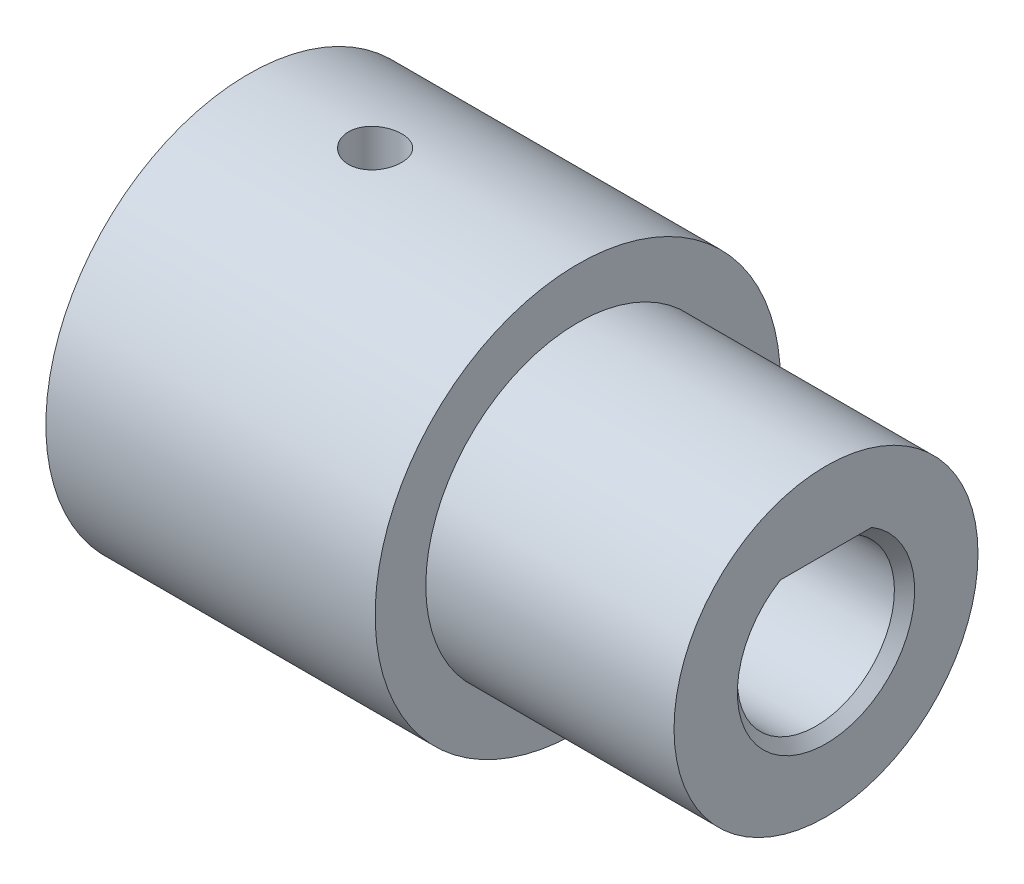
ISO-10303-21;
HEADER;
FILE_DESCRIPTION(('STEP AP214'),'2;1');
FILE_NAME('part.step','',(''),(''),'','','');
FILE_SCHEMA(('AUTOMOTIVE_DESIGN { 1 0 10303 214 1 1 1 1 }'));
ENDSEC;
DATA;
#1=APPLICATION_CONTEXT('core data for automotive mechanical design processes');
#2=APPLICATION_PROTOCOL_DEFINITION('international standard','automotive_design',2000,#1);
#3=PRODUCT_CONTEXT('',#1,'mechanical');
#4=PRODUCT('Part','Part','',(#3));
#5=PRODUCT_RELATED_PRODUCT_CATEGORY('part','',(#4));
#6=PRODUCT_DEFINITION_FORMATION('','',#4);
#7=PRODUCT_DEFINITION_CONTEXT('part definition',#1,'design');
#8=PRODUCT_DEFINITION('design','',#6,#7);
#9=PRODUCT_DEFINITION_SHAPE('','',#8);
#10=(LENGTH_UNIT() NAMED_UNIT(*) SI_UNIT(.MILLI.,.METRE.));
#11=(NAMED_UNIT(*) PLANE_ANGLE_UNIT() SI_UNIT($,.RADIAN.));
#12=(NAMED_UNIT(*) SI_UNIT($,.STERADIAN.) SOLID_ANGLE_UNIT());
#13=UNCERTAINTY_MEASURE_WITH_UNIT(LENGTH_MEASURE(1.E-05),#10,'distance_accuracy_value','');
#14=(GEOMETRIC_REPRESENTATION_CONTEXT(3) GLOBAL_UNCERTAINTY_ASSIGNED_CONTEXT((#13)) GLOBAL_UNIT_ASSIGNED_CONTEXT((#10,
#11,#12)) REPRESENTATION_CONTEXT('',''));
#15=CARTESIAN_POINT('',(0.,0.,0.));
#16=DIRECTION('',(0.,0.,1.));
#17=DIRECTION('',(1.,0.,0.));
#18=AXIS2_PLACEMENT_3D('',#15,#16,#17);
#19=CARTESIAN_POINT('',(64.4224155236953,0.,0.));
#20=DIRECTION('',(1.,0.,0.));
#21=DIRECTION('',(0.,0.,-1.));
#22=AXIS2_PLACEMENT_3D('',#19,#20,#21);
#23=CYLINDRICAL_SURFACE('',#22,6.15);
#24=DIRECTION('',(1.,0.,0.));
#25=VECTOR('',#24,1.);
#26=CARTESIAN_POINT('',(64.4224155236953,-5.88466282723188,1.78696485969796));
#27=LINE('',#26,#25);
#28=CARTESIAN_POINT('',(-3.4,-5.88466282723188,1.78696485969796));
#29=VERTEX_POINT('',#28);
#30=CARTESIAN_POINT('',(-12.6,-5.88466282723188,1.78696485969796));
#31=VERTEX_POINT('',#30);
#32=EDGE_CURVE('E230',#29,#31,#27,.F.);
#33=ORIENTED_EDGE('',*,*,#32,.T.);
#34=CARTESIAN_POINT('',(-12.6,0.,0.));
#35=DIRECTION('',(-1.,0.,0.));
#36=DIRECTION('',(0.,0.,1.));
#37=AXIS2_PLACEMENT_3D('',#34,#35,#36);
#38=CIRCLE('',#37,6.15);
#39=CARTESIAN_POINT('',(-12.6,-5.92383639227045,-1.6524716026644));
#40=VERTEX_POINT('',#39);
#41=EDGE_CURVE('E237',#31,#40,#38,.T.);
#42=ORIENTED_EDGE('',*,*,#41,.T.);
#43=DIRECTION('',(1.,0.,0.));
#44=VECTOR('',#43,1.);
#45=CARTESIAN_POINT('',(64.4224155236953,-5.92383639227044,-1.6524716026644));
#46=LINE('',#45,#44);
#47=CARTESIAN_POINT('',(-3.4,-5.92383639227045,-1.6524716026644));
#48=VERTEX_POINT('',#47);
#49=EDGE_CURVE('E233',#40,#48,#46,.T.);
#50=ORIENTED_EDGE('',*,*,#49,.T.);
#51=CARTESIAN_POINT('',(-3.4,0.,0.));
#52=DIRECTION('',(-1.,0.,0.));
#53=DIRECTION('',(0.,0.,1.));
#54=AXIS2_PLACEMENT_3D('',#51,#52,#53);
#55=CIRCLE('',#54,6.15);
#56=EDGE_CURVE('E227',#48,#29,#55,.F.);
#57=ORIENTED_EDGE('',*,*,#56,.T.);
#58=EDGE_LOOP('',(#33,#42,#50,#57));
#59=FACE_BOUND('',#58,.T.);
#60=CARTESIAN_POINT('',(-8.,6.05970296301725,-1.05));
#61=CARTESIAN_POINT('',(-8.05851594218072,6.05970403640949,-1.04999766669626));
#62=CARTESIAN_POINT('',(-8.11706331351538,6.06055974784049,-1.04509183481049));
#63=CARTESIAN_POINT('',(-8.2325138037891,6.06388680365105,-1.02560752718709));
#64=CARTESIAN_POINT('',(-8.28941537999875,6.06635961568257,-1.01102026457451));
#65=CARTESIAN_POINT('',(-8.39988681612571,6.07263282676781,-0.972628516425271));
#66=CARTESIAN_POINT('',(-8.45345947456061,6.07643209242815,-0.948831897981189));
#67=CARTESIAN_POINT('',(-8.55584646727556,6.08492878888852,-0.892716775180502));
#68=CARTESIAN_POINT('',(-8.60466130548713,6.08962612441174,-0.860399174682625));
#69=CARTESIAN_POINT('',(-8.69665704211011,6.09944394672495,-0.787803132419939));
#70=CARTESIAN_POINT('',(-8.73978161566207,6.1045679475072,-0.747453779533022));
#71=CARTESIAN_POINT('',(-8.81868316546817,6.11463057267134,-0.660092854155189));
#72=CARTESIAN_POINT('',(-8.85445969777878,6.11956918583802,-0.613080879421253));
#73=CARTESIAN_POINT('',(-8.91786184783567,6.12874186424498,-0.513363291171863));
#74=CARTESIAN_POINT('',(-8.9454349136287,6.13297131432108,-0.460623803429717));
#75=CARTESIAN_POINT('',(-8.99130950222018,6.14020997389829,-0.351177322317469));
#76=CARTESIAN_POINT('',(-9.0096116573664,6.14321926662077,-0.294470599843789));
#77=CARTESIAN_POINT('',(-9.03625225839365,6.14765373628896,-0.179281623251865));
#78=CARTESIAN_POINT('',(-9.04468540581851,6.1490939603835,-0.120821860206467));
#79=CARTESIAN_POINT('',(-9.05164319779301,6.15027974783618,-0.00330060250274968));
#80=CARTESIAN_POINT('',(-9.05016854758269,6.15002543181221,0.0557608490283978));
#81=CARTESIAN_POINT('',(-9.03742623027897,6.14786267650076,0.172161083198537));
#82=CARTESIAN_POINT('',(-9.02626048996959,6.14597145407333,0.229511389474483));
#83=CARTESIAN_POINT('',(-8.99461357678788,6.14076659938107,0.341512258310782));
#84=CARTESIAN_POINT('',(-8.97413210934256,6.13745292213693,0.396162735439137));
#85=CARTESIAN_POINT('',(-8.92433462205534,6.1297462668802,0.501514349744861));
#86=CARTESIAN_POINT('',(-8.8949768373612,6.12534820507824,0.552195358506424));
#87=CARTESIAN_POINT('',(-8.82829070503532,6.11596099877,0.647950039946135));
#88=CARTESIAN_POINT('',(-8.79096168127785,6.11097180413942,0.693023236452384));
#89=CARTESIAN_POINT('',(-8.70882804686535,6.10088182511079,0.776885370997246));
#90=CARTESIAN_POINT('',(-8.66393433256145,6.09578042866176,0.815587019048351));
#91=CARTESIAN_POINT('',(-8.5682452696662,6.08610229013769,0.884922736246885));
#92=CARTESIAN_POINT('',(-8.51744986130103,6.08152555337747,0.915556723672788));
#93=CARTESIAN_POINT('',(-8.41129538137196,6.07341450123819,0.967906118636874));
#94=CARTESIAN_POINT('',(-8.35593082411659,6.0698814629127,0.989610612822716));
#95=CARTESIAN_POINT('',(-8.24226772461767,6.06427864442241,1.02338677824146));
#96=CARTESIAN_POINT('',(-8.18396945484226,6.062208728638,1.03545934228967));
#97=CARTESIAN_POINT('',(-8.06687595640747,6.05979287437034,1.04950519628272));
#98=CARTESIAN_POINT('',(-8.00809610065977,6.05942566529278,1.05160310038));
#99=CARTESIAN_POINT('',(-7.89102530682419,6.06040009664132,1.045972526288));
#100=CARTESIAN_POINT('',(-7.83273434897397,6.06174166765633,1.03824444723276));
#101=CARTESIAN_POINT('',(-7.71869442754961,6.06596281567277,1.01328766400773));
#102=CARTESIAN_POINT('',(-7.66293108945363,6.06883206326903,0.99612274207733));
#103=CARTESIAN_POINT('',(-7.55507232740956,6.07577656195677,0.952846560921187));
#104=CARTESIAN_POINT('',(-7.50297713281996,6.07985188837816,0.926734742869445));
#105=CARTESIAN_POINT('',(-7.40337988913715,6.08879859831972,0.866013246038964));
#106=CARTESIAN_POINT('',(-7.35592706561563,6.09367729075433,0.831323922428448));
#107=CARTESIAN_POINT('',(-7.26747124283651,6.10365980462157,0.754541072739141));
#108=CARTESIAN_POINT('',(-7.22646872097008,6.10876364268161,0.712446999117722));
#109=CARTESIAN_POINT('',(-7.15162041524425,6.11868885602438,0.621496609462333));
#110=CARTESIAN_POINT('',(-7.1178578684531,6.1235065286045,0.572571327065425));
#111=CARTESIAN_POINT('',(-7.05903175742023,6.13225666417695,0.469670757950696));
#112=CARTESIAN_POINT('',(-7.03396790120267,6.13618915687922,0.415695640810294));
#113=CARTESIAN_POINT('',(-6.99337925938052,6.14270978555768,0.304471597401119));
#114=CARTESIAN_POINT('',(-6.97781141843315,6.14530398104092,0.247238753735253));
#115=CARTESIAN_POINT('',(-6.95651829371541,6.14888138191237,0.130922933911137));
#116=CARTESIAN_POINT('',(-6.9507921583233,6.14986472669025,0.071840118285066));
#117=CARTESIAN_POINT('',(-6.94937045652596,6.15010751038329,-0.0456960872884216));
#118=CARTESIAN_POINT('',(-6.95354842001732,6.14938868523517,-0.104147940994627));
#119=CARTESIAN_POINT('',(-6.97154212892153,6.14635241606615,-0.219504295052805));
#120=CARTESIAN_POINT('',(-6.98535781374475,6.14403498209525,-0.276408805130151));
#121=CARTESIAN_POINT('',(-7.02218534450903,6.13806110366987,-0.387003387880113));
#122=CARTESIAN_POINT('',(-7.0451859274257,6.13440629962929,-0.440697305181565));
#123=CARTESIAN_POINT('',(-7.09971608489215,6.12615602619281,-0.543483296208732));
#124=CARTESIAN_POINT('',(-7.13124609579508,6.12156050867428,-0.592575134325693));
#125=CARTESIAN_POINT('',(-7.20238603514422,6.11186835562499,-0.685399283078262));
#126=CARTESIAN_POINT('',(-7.24208835446029,6.1067663699173,-0.729060234993585));
#127=CARTESIAN_POINT('',(-7.32825234749357,6.09667272365645,-0.809144657593164));
#128=CARTESIAN_POINT('',(-7.37471560251246,6.09168108922861,-0.845566430392359));
#129=CARTESIAN_POINT('',(-7.47349516093564,6.0823329714442,-0.910389650890562));
#130=CARTESIAN_POINT('',(-7.52585257278839,6.07798150829687,-0.938729189472745));
#131=CARTESIAN_POINT('',(-7.63463864674982,6.0704659233341,-0.98616691633092));
#132=CARTESIAN_POINT('',(-7.69106321928578,6.0673006281362,-1.00527424275123));
#133=CARTESIAN_POINT('',(-7.78974842866411,6.0632100093696,-1.02960464378359));
#134=CARTESIAN_POINT('',(-7.83141496587948,6.06190227061835,-1.03724047880882));
#135=CARTESIAN_POINT('',(-7.91538219813421,6.06014836779263,-1.04743895070828));
#136=CARTESIAN_POINT('',(-7.95768288068211,6.05970218676951,-1.05000168738107));
#137=CARTESIAN_POINT('',(-8.,6.05970296301725,-1.05));
#138=B_SPLINE_CURVE_WITH_KNOTS('',3,(#60,#61,#62,#63,#64,#65,#66,#67,#68,#69,#70,#71,#72,#73,
#74,#75,#76,#77,#78,#79,#80,#81,#82,#83,#84,#85,#86,#87,#88,#89,#90,#91,#92,#93,#94,#95,#96,#97,
#98,#99,#100,#101,#102,#103,#104,#105,#106,#107,#108,#109,#110,#111,#112,#113,#114,#115,#116,
#117,#118,#119,#120,#121,#122,#123,#124,#125,#126,#127,#128,#129,#130,#131,#132,#133,#134,#135,
#136,#137),.UNSPECIFIED.,.T.,.F.,(4,2,2,2,2,2,2,2,2,2,2,2,2,2,2,2,2,2,2,2,2,2,2,2,2,2,2,2,2,2,2,
2,2,2,2,2,2,2,4),(0.,0.175393059979234,0.350945524940029,0.526348354054166,0.701732584884747,
0.878740037292407,1.05575818074162,1.23388703566752,1.41200373919237,1.58839686998459,
1.76477744519338,1.93932510040236,2.11387827537397,2.28926588848672,2.46466838400524,
2.64230344965484,2.81994031459314,2.99779364149136,3.17563048066336,3.35123964775749,
3.52684168178882,3.7012711839263,3.87571158297313,4.05183690468288,4.22797525541994,
4.40604132569536,4.58410141851702,4.76134805889002,4.93857936099748,5.1135597279328,
5.28853899482628,5.46330434824287,5.63807864409259,5.81494956757717,5.99186192573849,
6.17009509458368,6.34815148304473,6.47499341335182,6.60183284838558),.UNSPECIFIED.);
#139=CARTESIAN_POINT('',(-8.,6.05970296301725,-1.05));
#140=VERTEX_POINT('',#139);
#141=EDGE_CURVE('E346',#140,#140,#138,.T.);
#142=ORIENTED_EDGE('',*,*,#141,.T.);
#143=EDGE_LOOP('',(#142));
#144=FACE_BOUND('',#143,.T.);
#145=ADVANCED_FACE('F41',(#59,#144),#23,.F.);
#146=CARTESIAN_POINT('',(64.4224155236953,0.,0.));
#147=DIRECTION('',(1.,0.,0.));
#148=DIRECTION('',(0.,0.,-1.));
#149=AXIS2_PLACEMENT_3D('',#146,#147,#148);
#150=CYLINDRICAL_SURFACE('',#149,8.);
#151=CARTESIAN_POINT('',(0.,0.,0.));
#152=DIRECTION('',(1.,0.,0.));
#153=DIRECTION('',(0.,0.,-1.));
#154=AXIS2_PLACEMENT_3D('',#151,#152,#153);
#155=CIRCLE('',#154,8.);
#156=CARTESIAN_POINT('',(0.,0.,-8.));
#157=VERTEX_POINT('',#156);
#158=EDGE_CURVE('E194',#157,#157,#155,.T.);
#159=ORIENTED_EDGE('',*,*,#158,.F.);
#160=EDGE_LOOP('',(#159));
#161=FACE_BOUND('',#160,.T.);
#162=CARTESIAN_POINT('',(-13.,0.,0.));
#163=DIRECTION('',(1.,0.,0.));
#164=DIRECTION('',(0.,0.,-1.));
#165=AXIS2_PLACEMENT_3D('',#162,#163,#164);
#166=CIRCLE('',#165,8.);
#167=CARTESIAN_POINT('',(-13.,0.,-8.));
#168=VERTEX_POINT('',#167);
#169=EDGE_CURVE('E198',#168,#168,#166,.T.);
#170=ORIENTED_EDGE('',*,*,#169,.T.);
#171=EDGE_LOOP('',(#170));
#172=FACE_BOUND('',#171,.T.);
#173=CARTESIAN_POINT('',(-8.,7.9307944116589,-1.05));
#174=CARTESIAN_POINT('',(-8.058705786812,7.93079529136492,-1.0499975193274));
#175=CARTESIAN_POINT('',(-8.1174476573441,7.93145328668743,-1.04505999348399));
#176=CARTESIAN_POINT('',(-8.23329484282718,7.93401299442524,-1.02544229083246));
#177=CARTESIAN_POINT('',(-8.29039841109271,7.93591598626199,-1.01075209145367));
#178=CARTESIAN_POINT('',(-8.40127504207085,7.94074651458308,-0.972071107293058));
#179=CARTESIAN_POINT('',(-8.45505040357776,7.94367333440062,-0.948086826989492));
#180=CARTESIAN_POINT('',(-8.55780363002214,7.95022087989554,-0.891512777941059));
#181=CARTESIAN_POINT('',(-8.6067822758742,7.95384149233741,-0.858924413161269));
#182=CARTESIAN_POINT('',(-8.69886277281236,7.9613936265497,-0.785852504342706));
#183=CARTESIAN_POINT('',(-8.74193081177151,7.96532674914235,-0.745326513039943));
#184=CARTESIAN_POINT('',(-8.8206752551382,7.97304637117567,-0.657621197916249));
#185=CARTESIAN_POINT('',(-8.85635128304945,7.97683286314005,-0.61044153541036));
#186=CARTESIAN_POINT('',(-8.91942117258687,7.98384907013011,-0.51055455291898));
#187=CARTESIAN_POINT('',(-8.94678429527151,7.98707670016612,-0.457827665063542));
#188=CARTESIAN_POINT('',(-8.99225466562699,7.99259388757933,-0.348477431129993));
#189=CARTESIAN_POINT('',(-9.01036229058938,7.99488348319385,-0.291854243987588));
#190=CARTESIAN_POINT('',(-9.03670625224665,7.99825534668574,-0.176665230348672));
#191=CARTESIAN_POINT('',(-9.04499891939988,7.99934450168126,-0.118112491578142));
#192=CARTESIAN_POINT('',(-9.05165222138351,8.00021630498533,-0.000437050286207967));
#193=CARTESIAN_POINT('',(-9.05001328466698,7.99999900965464,0.0586856275379536));
#194=CARTESIAN_POINT('',(-9.03689488472731,7.99828795149293,0.1754391688119));
#195=CARTESIAN_POINT('',(-9.02547600797961,7.99680204783657,0.23307697115958));
#196=CARTESIAN_POINT('',(-8.99321666861339,7.99272953138791,0.345611094623022));
#197=CARTESIAN_POINT('',(-8.97237601154673,7.99014289587862,0.400507359132538));
#198=CARTESIAN_POINT('',(-8.92180083617473,7.98414600668745,0.50618669078302));
#199=CARTESIAN_POINT('',(-8.89204026572457,7.98073334615367,0.556957147966902));
#200=CARTESIAN_POINT('',(-8.82448902351299,7.9734658754444,0.652806134343697));
#201=CARTESIAN_POINT('',(-8.7866979459207,7.96961104292778,0.697884375690357));
#202=CARTESIAN_POINT('',(-8.70381952190501,7.96185600462309,0.781425554663758));
#203=CARTESIAN_POINT('',(-8.65867934994299,7.95795567579852,0.819836093341264));
#204=CARTESIAN_POINT('',(-8.56256509980749,7.95057782069157,0.888543839212933));
#205=CARTESIAN_POINT('',(-8.51159099980058,7.94710029599163,0.918841016041492));
#206=CARTESIAN_POINT('',(-8.40520732838194,7.94096186330058,0.970465953738743));
#207=CARTESIAN_POINT('',(-8.3497955610101,7.93830136279787,0.991789240863992));
#208=CARTESIAN_POINT('',(-8.23613499987128,7.93410597283342,1.0248131933979));
#209=CARTESIAN_POINT('',(-8.17788635755864,7.93257102335115,1.03651437191404));
#210=CARTESIAN_POINT('',(-8.06066909160379,7.93081160777553,1.04989198580907));
#211=CARTESIAN_POINT('',(-8.00170903763864,7.93057748578764,1.05164228767621));
#212=CARTESIAN_POINT('',(-7.88433652319767,7.93142067401688,1.04526362003668));
#213=CARTESIAN_POINT('',(-7.82592404985335,7.93249795333695,1.03713488328349));
#214=CARTESIAN_POINT('',(-7.71152791204886,7.93583373779959,1.01129118533088));
#215=CARTESIAN_POINT('',(-7.65553597225641,7.9380878049313,0.993612232150103));
#216=CARTESIAN_POINT('',(-7.5473109375314,7.9435195776151,0.949207098305332));
#217=CARTESIAN_POINT('',(-7.49507798748976,7.94669731874662,0.922480569127158));
#218=CARTESIAN_POINT('',(-7.3955201535732,7.95364143108383,0.860558306185699));
#219=CARTESIAN_POINT('',(-7.34822554246843,7.95741111433437,0.825314277810184));
#220=CARTESIAN_POINT('',(-7.26019632853105,7.9651040667192,0.747425468909319));
#221=CARTESIAN_POINT('',(-7.21946200775284,7.96902734244807,0.704780370344589));
#222=CARTESIAN_POINT('',(-7.14544883909333,7.97661521083551,0.61297666154277));
#223=CARTESIAN_POINT('',(-7.11221862679116,7.9802780161675,0.563778671755127));
#224=CARTESIAN_POINT('',(-7.05449402445593,7.98690528284861,0.460456407176137));
#225=CARTESIAN_POINT('',(-7.02999944308408,7.98986975949293,0.406332240316728));
#226=CARTESIAN_POINT('',(-6.99052112354653,7.99475844507941,0.29485333001303));
#227=CARTESIAN_POINT('',(-6.97550963326001,7.99668568699924,0.23750855303534));
#228=CARTESIAN_POINT('',(-6.95533343598477,7.99929538339607,0.121085362063825));
#229=CARTESIAN_POINT('',(-6.95016823709322,7.9999779000572,0.0620070348247519));
#230=CARTESIAN_POINT('',(-6.94984109177122,8.00002087538993,-0.0557321081117163));
#231=CARTESIAN_POINT('',(-6.95460428926407,7.99939122725859,-0.114392726209666));
#232=CARTESIAN_POINT('',(-6.97383973985836,7.99690034737272,-0.230071872148554));
#233=CARTESIAN_POINT('',(-6.98831198118336,7.99503911711201,-0.287090401981152));
#234=CARTESIAN_POINT('',(-7.02653046481447,7.9902932382702,-0.397854476237595));
#235=CARTESIAN_POINT('',(-7.05027274221942,7.98740902727799,-0.451601408616163));
#236=CARTESIAN_POINT('',(-7.10634956299659,7.98093595043204,-0.554360158434477));
#237=CARTESIAN_POINT('',(-7.13868425065384,7.97734707274571,-0.603371896341286));
#238=CARTESIAN_POINT('',(-7.21130360866095,7.96983261673776,-0.695650857249759));
#239=CARTESIAN_POINT('',(-7.25164389979713,7.96590479804306,-0.738874129724907));
#240=CARTESIAN_POINT('',(-7.33901319163075,7.95817280275475,-0.817966442093437));
#241=CARTESIAN_POINT('',(-7.38604377002707,7.95436865558598,-0.853833742421301));
#242=CARTESIAN_POINT('',(-7.48568997719449,7.94729744300805,-0.917328400153358));
#243=CARTESIAN_POINT('',(-7.53832852894177,7.94403273286273,-0.944920030614197));
#244=CARTESIAN_POINT('',(-7.64750669200919,7.93843761319059,-0.990831948487555));
#245=CARTESIAN_POINT('',(-7.70404203068895,7.93610619886625,-1.00916221240458));
#246=CARTESIAN_POINT('',(-7.80071783964906,7.93320139002558,-1.03169543888643));
#247=CARTESIAN_POINT('',(-7.8402512340156,7.93230333501623,-1.03854963380227));
#248=CARTESIAN_POINT('',(-7.91985081478269,7.93109954809079,-1.04770274139347));
#249=CARTESIAN_POINT('',(-7.95991699653925,7.93079381101522,-1.05000169374799));
#250=CARTESIAN_POINT('',(-8.,7.9307944116589,-1.05));
#251=B_SPLINE_CURVE_WITH_KNOTS('',3,(#173,#174,#175,#176,#177,#178,#179,#180,#181,#182,#183,
#184,#185,#186,#187,#188,#189,#190,#191,#192,#193,#194,#195,#196,#197,#198,#199,#200,#201,#202,
#203,#204,#205,#206,#207,#208,#209,#210,#211,#212,#213,#214,#215,#216,#217,#218,#219,#220,#221,
#222,#223,#224,#225,#226,#227,#228,#229,#230,#231,#232,#233,#234,#235,#236,#237,#238,#239,#240,
#241,#242,#243,#244,#245,#246,#247,#248,#249,#250),.UNSPECIFIED.,.T.,.F.,(4,2,2,2,2,2,2,2,2,2,2,
2,2,2,2,2,2,2,2,2,2,2,2,2,2,2,2,2,2,2,2,2,2,2,2,2,2,2,4),(0.,0.175970913227533,
0.352122947731742,0.528151923939187,0.704152194482435,0.881120690139891,1.05809819709549,
1.23572237094825,1.41333930354323,1.58993182797333,1.76651673419049,1.94201554924016,
2.11751798642668,2.29353808817016,2.46956708740717,2.64692230258793,2.82427818154078,
3.00172237308885,3.17915710165423,3.35527297487429,3.53138469882542,3.70683700116163,
3.88229606271974,4.05877434178645,4.23526020637046,4.41285902494071,4.59045395327887,
4.76752671530614,4.94459063086834,5.1203243866906,5.29605792935957,5.47171639096163,
5.64737780243313,5.82430531724023,6.00127462434967,6.17899727980414,6.35652807896835,
6.47667814504946,6.59682716454012),.UNSPECIFIED.);
#252=CARTESIAN_POINT('',(-8.,7.9307944116589,-1.05));
#253=VERTEX_POINT('',#252);
#254=EDGE_CURVE('E465',#253,#253,#251,.T.);
#255=ORIENTED_EDGE('',*,*,#254,.F.);
#256=EDGE_LOOP('',(#255));
#257=FACE_BOUND('',#256,.T.);
#258=ADVANCED_FACE('F446',(#161,#172,#257),#150,.T.);
#259=CARTESIAN_POINT('',(-13.,6.15,0.));
#260=DIRECTION('',(-1.,0.,0.));
#261=DIRECTION('',(0.,0.,1.));
#262=AXIS2_PLACEMENT_3D('',#259,#260,#261);
#263=PLANE('',#262);
#264=DIRECTION('',(0.,-1.,0.));
#265=VECTOR('',#264,1.);
#266=CARTESIAN_POINT('',(-13.,-7.02162768692984,-1.25));
#267=LINE('',#266,#265);
#268=CARTESIAN_POINT('',(-13.,-6.53717503500527,-1.25));
#269=VERTEX_POINT('',#268);
#270=CARTESIAN_POINT('',(-13.,-7.02162768692984,-1.25));
#271=VERTEX_POINT('',#270);
#272=EDGE_CURVE('E154',#269,#271,#267,.T.);
#273=ORIENTED_EDGE('',*,*,#272,.F.);
#274=DIRECTION('',(0.,0.836067845153159,-0.548626064183022));
#275=VECTOR('',#274,1.);
#276=CARTESIAN_POINT('',(-13.,1.7579193388564,-6.69322449995045));
#277=LINE('',#276,#275);
#278=CARTESIAN_POINT('',(-13.,-6.41327826819358,-1.33130081300813));
#279=VERTEX_POINT('',#278);
#280=EDGE_CURVE('E224',#269,#279,#277,.T.);
#281=ORIENTED_EDGE('',*,*,#280,.T.);
#282=CARTESIAN_POINT('',(-13.,0.,0.));
#283=DIRECTION('',(-1.,0.,0.));
#284=DIRECTION('',(0.,0.,1.));
#285=AXIS2_PLACEMENT_3D('',#282,#283,#284);
#286=CIRCLE('',#285,6.55000000000001);
#287=CARTESIAN_POINT('',(-13.,-6.42961896227141,1.25));
#288=VERTEX_POINT('',#287);
#289=EDGE_CURVE('E221',#279,#288,#286,.F.);
#290=ORIENTED_EDGE('',*,*,#289,.T.);
#291=DIRECTION('',(0.,1.,0.));
#292=VECTOR('',#291,1.);
#293=CARTESIAN_POINT('',(-13.,-7.02162768692984,1.25));
#294=LINE('',#293,#292);
#295=CARTESIAN_POINT('',(-13.,-7.02162768692984,1.25));
#296=VERTEX_POINT('',#295);
#297=EDGE_CURVE('E160',#296,#288,#294,.T.);
#298=ORIENTED_EDGE('',*,*,#297,.F.);
#299=DIRECTION('',(0.,0.,1.));
#300=VECTOR('',#299,1.);
#301=CARTESIAN_POINT('',(-13.,-7.02162768692984,-1.25));
#302=LINE('',#301,#300);
#303=EDGE_CURVE('E142',#271,#296,#302,.T.);
#304=ORIENTED_EDGE('',*,*,#303,.F.);
#305=EDGE_LOOP('',(#273,#281,#290,#298,#304));
#306=FACE_BOUND('',#305,.T.);
#307=ORIENTED_EDGE('',*,*,#169,.F.);
#308=EDGE_LOOP('',(#307));
#309=FACE_BOUND('',#308,.T.);
#310=ADVANCED_FACE('F162',(#306,#309),#263,.T.);
#311=CARTESIAN_POINT('',(0.,8.,0.));
#312=DIRECTION('',(1.,0.,0.));
#313=DIRECTION('',(0.,0.,-1.));
#314=AXIS2_PLACEMENT_3D('',#311,#312,#313);
#315=PLANE('',#314);
#316=ORIENTED_EDGE('',*,*,#158,.T.);
#317=EDGE_LOOP('',(#316));
#318=FACE_BOUND('',#317,.T.);
#319=CARTESIAN_POINT('',(0.,0.,0.));
#320=DIRECTION('',(1.,0.,0.));
#321=DIRECTION('',(0.,0.,-1.));
#322=AXIS2_PLACEMENT_3D('',#319,#320,#321);
#323=CIRCLE('',#322,6.);
#324=CARTESIAN_POINT('',(0.,0.,-6.));
#325=VERTEX_POINT('',#324);
#326=EDGE_CURVE('E190',#325,#325,#323,.T.);
#327=ORIENTED_EDGE('',*,*,#326,.F.);
#328=EDGE_LOOP('',(#327));
#329=FACE_BOUND('',#328,.T.);
#330=ADVANCED_FACE('F569',(#318,#329),#315,.T.);
#331=CARTESIAN_POINT('',(64.4224155236953,0.,0.));
#332=DIRECTION('',(1.,0.,0.));
#333=DIRECTION('',(0.,0.,-1.));
#334=AXIS2_PLACEMENT_3D('',#331,#332,#333);
#335=CYLINDRICAL_SURFACE('',#334,6.);
#336=ORIENTED_EDGE('',*,*,#326,.T.);
#337=EDGE_LOOP('',(#336));
#338=FACE_BOUND('',#337,.T.);
#339=CARTESIAN_POINT('',(9.8,0.,0.));
#340=DIRECTION('',(1.,0.,0.));
#341=DIRECTION('',(0.,0.,-1.));
#342=AXIS2_PLACEMENT_3D('',#339,#340,#341);
#343=CIRCLE('',#342,6.);
#344=CARTESIAN_POINT('',(9.8,0.,-6.));
#345=VERTEX_POINT('',#344);
#346=EDGE_CURVE('E186',#345,#345,#343,.T.);
#347=ORIENTED_EDGE('',*,*,#346,.F.);
#348=EDGE_LOOP('',(#347));
#349=FACE_BOUND('',#348,.T.);
#350=ADVANCED_FACE('F577',(#338,#349),#335,.T.);
#351=CARTESIAN_POINT('',(9.8,6.,0.));
#352=DIRECTION('',(1.,0.,0.));
#353=DIRECTION('',(0.,0.,-1.));
#354=AXIS2_PLACEMENT_3D('',#351,#352,#353);
#355=PLANE('',#354);
#356=CARTESIAN_POINT('',(9.8,0.,0.));
#357=DIRECTION('',(1.,0.,0.));
#358=DIRECTION('',(0.,0.,-1.));
#359=AXIS2_PLACEMENT_3D('',#356,#357,#358);
#360=CIRCLE('',#359,3.5);
#361=CARTESIAN_POINT('',(9.8,2.99999999999915,-1.80277563773341));
#362=VERTEX_POINT('',#361);
#363=CARTESIAN_POINT('',(9.8,2.99999999999915,1.80277563773341));
#364=VERTEX_POINT('',#363);
#365=EDGE_CURVE('E202',#362,#364,#360,.F.);
#366=ORIENTED_EDGE('',*,*,#365,.T.);
#367=DIRECTION('',(0.,0.,-1.));
#368=VECTOR('',#367,1.);
#369=CARTESIAN_POINT('',(9.8,3.,0.));
#370=LINE('',#369,#368);
#371=EDGE_CURVE('E205',#364,#362,#370,.T.);
#372=ORIENTED_EDGE('',*,*,#371,.T.);
#373=EDGE_LOOP('',(#366,#372));
#374=FACE_BOUND('',#373,.T.);
#375=ORIENTED_EDGE('',*,*,#346,.T.);
#376=EDGE_LOOP('',(#375));
#377=FACE_BOUND('',#376,.T.);
#378=ADVANCED_FACE('F585',(#374,#377),#355,.T.);
#379=CARTESIAN_POINT('',(64.4224155236953,0.,0.));
#380=DIRECTION('',(1.,0.,0.));
#381=DIRECTION('',(0.,0.,-1.));
#382=AXIS2_PLACEMENT_3D('',#379,#380,#381);
#383=CYLINDRICAL_SURFACE('',#382,3.1);
#384=DIRECTION('',(1.,0.,0.));
#385=VECTOR('',#384,1.);
#386=CARTESIAN_POINT('',(-3.4132096331752,2.6,1.68819430161341));
#387=LINE('',#386,#385);
#388=CARTESIAN_POINT('',(0.,2.6,1.68819430161341));
#389=VERTEX_POINT('',#388);
#390=CARTESIAN_POINT('',(9.40000000000001,2.6,1.68819430161341));
#391=VERTEX_POINT('',#390);
#392=EDGE_CURVE('E177',#389,#391,#387,.T.);
#393=ORIENTED_EDGE('',*,*,#392,.T.);
#394=CARTESIAN_POINT('',(9.40000000000001,0.,0.));
#395=DIRECTION('',(1.,0.,0.));
#396=DIRECTION('',(0.,0.,-1.));
#397=AXIS2_PLACEMENT_3D('',#394,#395,#396);
#398=CIRCLE('',#397,3.1);
#399=CARTESIAN_POINT('',(9.40000000000001,2.6,-1.68819430161341));
#400=VERTEX_POINT('',#399);
#401=EDGE_CURVE('E213',#391,#400,#398,.T.);
#402=ORIENTED_EDGE('',*,*,#401,.T.);
#403=DIRECTION('',(1.,0.,0.));
#404=VECTOR('',#403,1.);
#405=CARTESIAN_POINT('',(-3.4132096331752,2.6,-1.68819430161341));
#406=LINE('',#405,#404);
#407=CARTESIAN_POINT('',(0.,2.6,-1.68819430161341));
#408=VERTEX_POINT('',#407);
#409=EDGE_CURVE('E172',#408,#400,#406,.T.);
#410=ORIENTED_EDGE('',*,*,#409,.F.);
#411=CARTESIAN_POINT('',(0.,0.,0.));
#412=DIRECTION('',(1.,0.,0.));
#413=DIRECTION('',(0.,0.,-1.));
#414=AXIS2_PLACEMENT_3D('',#411,#412,#413);
#415=CIRCLE('',#414,3.1);
#416=EDGE_CURVE('E183',#389,#408,#415,.T.);
#417=ORIENTED_EDGE('',*,*,#416,.F.);
#418=EDGE_LOOP('',(#393,#402,#410,#417));
#419=FACE_BOUND('',#418,.T.);
#420=ADVANCED_FACE('F592',(#419),#383,.F.);
#421=CARTESIAN_POINT('',(0.,0.,0.));
#422=DIRECTION('',(1.,0.,0.));
#423=DIRECTION('',(0.,0.,-1.));
#424=AXIS2_PLACEMENT_3D('',#421,#422,#423);
#425=PLANE('',#424);
#426=DIRECTION('',(0.,0.,1.));
#427=VECTOR('',#426,1.);
#428=CARTESIAN_POINT('',(0.,2.6,-1.68819430161341));
#429=LINE('',#428,#427);
#430=EDGE_CURVE('E176',#408,#389,#429,.T.);
#431=ORIENTED_EDGE('',*,*,#430,.T.);
#432=ORIENTED_EDGE('',*,*,#416,.T.);
#433=EDGE_LOOP('',(#431,#432));
#434=FACE_BOUND('',#433,.T.);
#435=ADVANCED_FACE('F276',(#434),#425,.T.);
#436=CARTESIAN_POINT('',(-3.,0.,0.));
#437=DIRECTION('',(-1.,0.,0.));
#438=DIRECTION('',(0.,0.,1.));
#439=AXIS2_PLACEMENT_3D('',#436,#437,#438);
#440=PLANE('',#439);
#441=DIRECTION('',(0.,0.,-1.));
#442=VECTOR('',#441,1.);
#443=CARTESIAN_POINT('',(-3.,-7.02162768692984,-1.25));
#444=LINE('',#443,#442);
#445=CARTESIAN_POINT('',(-3.,-7.02162768692984,0.850000000000004));
#446=VERTEX_POINT('',#445);
#447=CARTESIAN_POINT('',(-3.,-7.02162768692984,-0.850000000000009));
#448=VERTEX_POINT('',#447);
#449=EDGE_CURVE('E170',#446,#448,#444,.T.);
#450=ORIENTED_EDGE('',*,*,#449,.F.);
#451=DIRECTION('',(0.,1.,0.));
#452=VECTOR('',#451,1.);
#453=CARTESIAN_POINT('',(-3.,0.,0.850000000000003));
#454=LINE('',#453,#452);
#455=CARTESIAN_POINT('',(-3.,-6.42162768692984,0.850000000000004));
#456=VERTEX_POINT('',#455);
#457=EDGE_CURVE('E11',#446,#456,#454,.T.);
#458=ORIENTED_EDGE('',*,*,#457,.T.);
#459=CARTESIAN_POINT('',(-3.,-5.50192052952574,1.67073950296964));
#460=CARTESIAN_POINT('',(-3.,-5.65520505575976,1.53394958580803));
#461=CARTESIAN_POINT('',(-3.,-5.80848958199378,1.39715966864643));
#462=CARTESIAN_POINT('',(-3.,-6.0384163713448,1.19197479290402));
#463=CARTESIAN_POINT('',(-3.,-6.11505863446181,1.12357983432321));
#464=CARTESIAN_POINT('',(-3.,-6.26834316069582,0.986789917161609));
#465=CARTESIAN_POINT('',(-3.,-6.34498542381283,0.918394958580807));
#466=CARTESIAN_POINT('',(-3.,-6.42162768692984,0.850000000000004));
#467=B_SPLINE_CURVE_WITH_KNOTS('',3,(#459,#460,#461,#462,#463,#464,#465,#466),.UNSPECIFIED.,.F.,
.F.,(4,2,2,4),(0.,0.616334849557275,0.924502274335913,1.23266969911455),.UNSPECIFIED.);
#468=CARTESIAN_POINT('',(-3.,-5.50192052952574,1.67073950296964));
#469=VERTEX_POINT('',#468);
#470=EDGE_CURVE('E52',#469,#456,#467,.T.);
#471=ORIENTED_EDGE('',*,*,#470,.F.);
#472=CARTESIAN_POINT('',(-3.,0.,0.));
#473=DIRECTION('',(-1.,0.,0.));
#474=DIRECTION('',(0.,0.,1.));
#475=AXIS2_PLACEMENT_3D('',#472,#473,#474);
#476=CIRCLE('',#475,5.75000000000001);
#477=CARTESIAN_POINT('',(-3.,-5.53854622041546,-1.54499377484884));
#478=VERTEX_POINT('',#477);
#479=EDGE_CURVE('E499',#469,#478,#476,.T.);
#480=ORIENTED_EDGE('',*,*,#479,.T.);
#481=CARTESIAN_POINT('',(-3.,-6.53717503500527,-0.850000000000009));
#482=CARTESIAN_POINT('',(-3.,-6.37073689924031,-0.965832295808147));
#483=CARTESIAN_POINT('',(-3.,-6.20429876347534,-1.08166459161628));
#484=CARTESIAN_POINT('',(-3.,-5.8714224919454,-1.31332918323256));
#485=CARTESIAN_POINT('',(-3.,-5.70498435618043,-1.4291614790407));
#486=CARTESIAN_POINT('',(-3.,-5.53854622041546,-1.54499377484884));
#487=B_SPLINE_CURVE_WITH_KNOTS('',3,(#481,#482,#483,#484,#485,#486),.UNSPECIFIED.,.F.,.F.,(4,2,
4),(0.,0.608332938531128,1.21666587706226),.UNSPECIFIED.);
#488=CARTESIAN_POINT('',(-3.,-6.53717503500527,-0.850000000000009));
#489=VERTEX_POINT('',#488);
#490=EDGE_CURVE('E280',#489,#478,#487,.T.);
#491=ORIENTED_EDGE('',*,*,#490,.F.);
#492=DIRECTION('',(0.,-1.,0.));
#493=VECTOR('',#492,1.);
#494=CARTESIAN_POINT('',(-3.,0.,-0.850000000000011));
#495=LINE('',#494,#493);
#496=EDGE_CURVE('E295',#489,#448,#495,.T.);
#497=ORIENTED_EDGE('',*,*,#496,.T.);
#498=EDGE_LOOP('',(#450,#458,#471,#480,#491,#497));
#499=FACE_BOUND('',#498,.T.);
#500=ADVANCED_FACE('F271',(#499),#440,.T.);
#501=CARTESIAN_POINT('',(-3.4132096331752,2.6,-1.68819430161341));
#502=DIRECTION('',(0.,-1.,0.));
#503=DIRECTION('',(0.,0.,-1.));
#504=AXIS2_PLACEMENT_3D('',#501,#502,#503);
#505=PLANE('',#504);
#506=ORIENTED_EDGE('',*,*,#409,.T.);
#507=DIRECTION('',(0.,0.,1.));
#508=VECTOR('',#507,1.);
#509=CARTESIAN_POINT('',(9.40000000000001,2.6,-1.68819430161341));
#510=LINE('',#509,#508);
#511=EDGE_CURVE('E209',#400,#391,#510,.T.);
#512=ORIENTED_EDGE('',*,*,#511,.T.);
#513=ORIENTED_EDGE('',*,*,#392,.F.);
#514=ORIENTED_EDGE('',*,*,#430,.F.);
#515=EDGE_LOOP('',(#506,#512,#513,#514));
#516=FACE_BOUND('',#515,.T.);
#517=ADVANCED_FACE('F266',(#516),#505,.T.);
#518=CARTESIAN_POINT('',(-0.307417596432749,-7.02162768692984,1.25));
#519=DIRECTION('',(0.,0.,1.));
#520=DIRECTION('',(0.,-1.,0.));
#521=AXIS2_PLACEMENT_3D('',#518,#519,#520);
#522=PLANE('',#521);
#523=ORIENTED_EDGE('',*,*,#297,.T.);
#524=CARTESIAN_POINT('',(-13.,-6.42961896227141,1.25));
#525=CARTESIAN_POINT('',(-12.9986926136262,-6.42828709786695,1.25));
#526=CARTESIAN_POINT('',(-12.9973852348008,-6.42695522605292,1.25));
#527=CARTESIAN_POINT('',(-12.994770492247,-6.42429146760573,1.25));
#528=CARTESIAN_POINT('',(-12.9934631285186,-6.42295958097257,1.25));
#529=CARTESIAN_POINT('',(-12.9921557723386,-6.42162768692984,1.25));
#530=B_SPLINE_CURVE_WITH_KNOTS('',3,(#524,#525,#526,#527,#528,#529),.UNSPECIFIED.,.F.,.F.,(4,2,
4),(0.,0.00559893715789433,0.0111978743157889),.UNSPECIFIED.);
#531=CARTESIAN_POINT('',(-12.9921557723386,-6.42162768692984,1.25));
#532=VERTEX_POINT('',#531);
#533=EDGE_CURVE('E246',#288,#532,#530,.T.);
#534=ORIENTED_EDGE('',*,*,#533,.T.);
#535=DIRECTION('',(1.,0.,0.));
#536=VECTOR('',#535,1.);
#537=CARTESIAN_POINT('',(-3.,-6.42162768692984,1.25));
#538=LINE('',#537,#536);
#539=CARTESIAN_POINT('',(-3.4,-6.42162768692984,1.25));
#540=VERTEX_POINT('',#539);
#541=EDGE_CURVE('E243',#532,#540,#538,.T.);
#542=ORIENTED_EDGE('',*,*,#541,.T.);
#543=DIRECTION('',(0.,-1.,0.));
#544=VECTOR('',#543,1.);
#545=CARTESIAN_POINT('',(-3.4,-7.02162768692984,1.25));
#546=LINE('',#545,#544);
#547=CARTESIAN_POINT('',(-3.4,-7.02162768692984,1.25));
#548=VERTEX_POINT('',#547);
#549=EDGE_CURVE('E240',#540,#548,#546,.T.);
#550=ORIENTED_EDGE('',*,*,#549,.T.);
#551=DIRECTION('',(-1.,0.,0.));
#552=VECTOR('',#551,1.);
#553=CARTESIAN_POINT('',(-0.307417596432749,-7.02162768692984,1.25));
#554=LINE('',#553,#552);
#555=EDGE_CURVE('E150',#548,#296,#554,.T.);
#556=ORIENTED_EDGE('',*,*,#555,.T.);
#557=EDGE_LOOP('',(#523,#534,#542,#550,#556));
#558=FACE_BOUND('',#557,.T.);
#559=ADVANCED_FACE('F261',(#558),#522,.F.);
#560=CARTESIAN_POINT('',(-0.307417596432749,-7.02162768692984,-1.25));
#561=DIRECTION('',(0.,-1.,0.));
#562=DIRECTION('',(0.,0.,-1.));
#563=AXIS2_PLACEMENT_3D('',#560,#561,#562);
#564=PLANE('',#563);
#565=ORIENTED_EDGE('',*,*,#555,.F.);
#566=DIRECTION('',(0.707106781186551,0.,-0.707106781186544));
#567=VECTOR('',#566,1.);
#568=CARTESIAN_POINT('',(-3.4,-7.02162768692984,1.25));
#569=LINE('',#568,#567);
#570=EDGE_CURVE('E515',#548,#446,#569,.T.);
#571=ORIENTED_EDGE('',*,*,#570,.T.);
#572=ORIENTED_EDGE('',*,*,#449,.T.);
#573=DIRECTION('',(-0.707106781186551,0.,-0.707106781186544));
#574=VECTOR('',#573,1.);
#575=CARTESIAN_POINT('',(-3.4,-7.02162768692984,-1.25));
#576=LINE('',#575,#574);
#577=CARTESIAN_POINT('',(-3.4,-7.02162768692984,-1.25));
#578=VERTEX_POINT('',#577);
#579=EDGE_CURVE('E146',#448,#578,#576,.T.);
#580=ORIENTED_EDGE('',*,*,#579,.T.);
#581=DIRECTION('',(-1.,0.,0.));
#582=VECTOR('',#581,1.);
#583=CARTESIAN_POINT('',(-0.307417596432749,-7.02162768692984,-1.25));
#584=LINE('',#583,#582);
#585=EDGE_CURVE('E137',#578,#271,#584,.T.);
#586=ORIENTED_EDGE('',*,*,#585,.T.);
#587=ORIENTED_EDGE('',*,*,#303,.T.);
#588=EDGE_LOOP('',(#565,#571,#572,#580,#586,#587));
#589=FACE_BOUND('',#588,.T.);
#590=ADVANCED_FACE('F140',(#589),#564,.F.);
#591=CARTESIAN_POINT('',(-0.307417596432749,-7.02162768692984,-1.25));
#592=DIRECTION('',(0.,0.,-1.));
#593=DIRECTION('',(0.,1.,0.));
#594=AXIS2_PLACEMENT_3D('',#591,#592,#593);
#595=PLANE('',#594);
#596=DIRECTION('',(0.,1.,0.));
#597=VECTOR('',#596,1.);
#598=CARTESIAN_POINT('',(-3.4,-7.02162768692984,-1.25));
#599=LINE('',#598,#597);
#600=CARTESIAN_POINT('',(-3.4,-6.53717503500527,-1.25));
#601=VERTEX_POINT('',#600);
#602=EDGE_CURVE('E216',#578,#601,#599,.T.);
#603=ORIENTED_EDGE('',*,*,#602,.T.);
#604=DIRECTION('',(-1.,0.,0.));
#605=VECTOR('',#604,1.);
#606=CARTESIAN_POINT('',(-13.,-6.53717503500527,-1.25));
#607=LINE('',#606,#605);
#608=EDGE_CURVE('E157',#601,#269,#607,.T.);
#609=ORIENTED_EDGE('',*,*,#608,.T.);
#610=ORIENTED_EDGE('',*,*,#272,.T.);
#611=ORIENTED_EDGE('',*,*,#585,.F.);
#612=EDGE_LOOP('',(#603,#609,#610,#611));
#613=FACE_BOUND('',#612,.T.);
#614=ADVANCED_FACE('F155',(#613),#595,.F.);
#615=CARTESIAN_POINT('',(9.40000000000001,0.,0.));
#616=DIRECTION('',(1.,0.,0.));
#617=DIRECTION('',(0.,0.,-1.));
#618=AXIS2_PLACEMENT_3D('',#615,#616,#617);
#619=CONICAL_SURFACE('',#618,3.1,0.785398163397456);
#620=CARTESIAN_POINT('',(9.8,3.,-1.80277563773392));
#621=CARTESIAN_POINT('',(9.73324715933132,2.93324715933131,-1.78428070950286));
#622=CARTESIAN_POINT('',(9.66653742623405,2.86653742623404,-1.76548480679686));
#623=CARTESIAN_POINT('',(9.53320409279408,2.73320409279407,-1.7272910288346));
#624=CARTESIAN_POINT('',(9.46658049255793,2.66658049255792,-1.70789315283444));
#625=CARTESIAN_POINT('',(9.39999999999973,2.59999999999972,-1.68819430161543));
#626=B_SPLINE_CURVE_WITH_KNOTS('',3,(#620,#621,#622,#623,#624,#625),.UNSPECIFIED.,.F.,.F.,(4,2,
4),(0.,0.288587883399794,0.577176123443517),.UNSPECIFIED.);
#627=EDGE_CURVE('E324',#400,#362,#626,.F.);
#628=ORIENTED_EDGE('',*,*,#627,.F.);
#629=ORIENTED_EDGE('',*,*,#401,.F.);
#630=CARTESIAN_POINT('',(9.40000000000001,2.6,1.68819430161341));
#631=CARTESIAN_POINT('',(9.46658049255808,2.66658049255806,1.70789315283334));
#632=CARTESIAN_POINT('',(9.53320409279413,2.73320409279412,1.72729102883417));
#633=CARTESIAN_POINT('',(9.66653742623398,2.86653742623397,1.76548480679729));
#634=CARTESIAN_POINT('',(9.73324715933123,2.93324715933122,1.78428070950347));
#635=CARTESIAN_POINT('',(9.79999999999992,2.99999999999992,1.80277563773447));
#636=B_SPLINE_CURVE_WITH_KNOTS('',3,(#630,#631,#632,#633,#634,#635),.UNSPECIFIED.,.F.,.F.,(4,2,
4),(0.,0.288588240043734,0.577176123443531),.UNSPECIFIED.);
#637=EDGE_CURVE('E330',#364,#391,#636,.F.);
#638=ORIENTED_EDGE('',*,*,#637,.F.);
#639=ORIENTED_EDGE('',*,*,#365,.F.);
#640=EDGE_LOOP('',(#628,#629,#638,#639));
#641=FACE_BOUND('',#640,.T.);
#642=ADVANCED_FACE('F320',(#641),#619,.F.);
#643=CARTESIAN_POINT('',(9.8,3.,0.));
#644=DIRECTION('',(-0.707106781186552,0.707106781186543,0.));
#645=DIRECTION('',(0.,0.,-1.));
#646=AXIS2_PLACEMENT_3D('',#643,#644,#645);
#647=PLANE('',#646);
#648=ORIENTED_EDGE('',*,*,#637,.T.);
#649=ORIENTED_EDGE('',*,*,#511,.F.);
#650=ORIENTED_EDGE('',*,*,#627,.T.);
#651=ORIENTED_EDGE('',*,*,#371,.F.);
#652=EDGE_LOOP('',(#648,#649,#650,#651));
#653=FACE_BOUND('',#652,.T.);
#654=ADVANCED_FACE('F310',(#653),#647,.F.);
#655=CARTESIAN_POINT('',(-3.4,-7.02162768692984,1.25));
#656=DIRECTION('',(0.707106781186544,0.,0.707106781186551));
#657=DIRECTION('',(0.,-1.,0.));
#658=AXIS2_PLACEMENT_3D('',#655,#656,#657);
#659=PLANE('',#658);
#660=DIRECTION('',(-0.707106781186551,0.,0.707106781186544));
#661=VECTOR('',#660,1.);
#662=CARTESIAN_POINT('',(-3.,-6.42162768692984,0.850000000000004));
#663=LINE('',#662,#661);
#664=EDGE_CURVE('E46',#456,#540,#663,.T.);
#665=ORIENTED_EDGE('',*,*,#664,.F.);
#666=ORIENTED_EDGE('',*,*,#457,.F.);
#667=ORIENTED_EDGE('',*,*,#570,.F.);
#668=ORIENTED_EDGE('',*,*,#549,.F.);
#669=EDGE_LOOP('',(#665,#666,#667,#668));
#670=FACE_BOUND('',#669,.T.);
#671=ADVANCED_FACE('F44',(#670),#659,.F.);
#672=CARTESIAN_POINT('',(-3.4,-6.42162768692984,1.25));
#673=CARTESIAN_POINT('',(-3.4,-5.88466282723188,1.78696485969796));
#674=CARTESIAN_POINT('',(-3.,-6.42162768692984,0.850000000000004));
#675=CARTESIAN_POINT('',(-3.,-5.50192052952574,1.67073950296964));
#676=B_SPLINE_SURFACE_WITH_KNOTS('',1,1,((#672,#673),(#674,#675)),.UNSPECIFIED.,.F.,.F.,.F.,(2,
2),(2,2),(0.,1.),(0.,1.),.UNSPECIFIED.);
#677=CARTESIAN_POINT('',(-3.4,-6.42162768692984,1.25));
#678=CARTESIAN_POINT('',(-3.4,-6.35496102026317,1.31666666666666));
#679=CARTESIAN_POINT('',(-3.4,-6.28829435359651,1.38333333333333));
#680=CARTESIAN_POINT('',(-3.4,-6.16546687698018,1.50616080994966));
#681=CARTESIAN_POINT('',(-3.4,-6.10930606703052,1.56232161989932));
#682=CARTESIAN_POINT('',(-3.4,-5.9969844471312,1.67464323979864));
#683=CARTESIAN_POINT('',(-3.4,-5.94082363718154,1.7308040497483));
#684=CARTESIAN_POINT('',(-3.4,-5.88466282723188,1.78696485969796));
#685=B_SPLINE_CURVE_WITH_KNOTS('',3,(#677,#678,#679,#680,#681,#682,#683,#684),.UNSPECIFIED.,.F.,
.F.,(4,2,2,4),(0.,0.282842712474617,0.52111284978862,0.759382987102623),.UNSPECIFIED.);
#686=EDGE_CURVE('E395',#29,#540,#685,.F.);
#687=DIRECTION('',(0.707106781186552,0.676599185387323,-0.205459344721055));
#688=VECTOR('',#687,1.);
#689=CARTESIAN_POINT('',(-3.4,-5.88466282723188,1.78696485969796));
#690=LINE('',#689,#688);
#691=EDGE_CURVE('E403',#469,#29,#690,.F.);
#692=ORIENTED_EDGE('',*,*,#686,.F.);
#693=ORIENTED_EDGE('',*,*,#691,.F.);
#694=ORIENTED_EDGE('',*,*,#470,.T.);
#695=ORIENTED_EDGE('',*,*,#664,.T.);
#696=EDGE_LOOP('',(#692,#693,#694,#695));
#697=FACE_BOUND('',#696,.T.);
#698=ADVANCED_FACE('F428',(#697),#676,.F.);
#699=CARTESIAN_POINT('',(-3.4,0.,0.));
#700=DIRECTION('',(-1.,0.,0.));
#701=DIRECTION('',(0.,0.,1.));
#702=AXIS2_PLACEMENT_3D('',#699,#700,#701);
#703=CONICAL_SURFACE('',#702,6.15,0.785398163397443);
#704=ORIENTED_EDGE('',*,*,#691,.T.);
#705=ORIENTED_EDGE('',*,*,#56,.F.);
#706=DIRECTION('',(-0.707106781186553,-0.681103233107976,-0.189995752188975));
#707=VECTOR('',#706,1.);
#708=CARTESIAN_POINT('',(-3.,-5.53854622041546,-1.54499377484884));
#709=LINE('',#708,#707);
#710=EDGE_CURVE('E404',#478,#48,#709,.T.);
#711=ORIENTED_EDGE('',*,*,#710,.F.);
#712=ORIENTED_EDGE('',*,*,#479,.F.);
#713=EDGE_LOOP('',(#704,#705,#711,#712));
#714=FACE_BOUND('',#713,.T.);
#715=ADVANCED_FACE('F422',(#714),#703,.F.);
#716=CARTESIAN_POINT('',(-3.4,-7.02162768692984,-1.25));
#717=DIRECTION('',(0.707106781186544,0.,-0.707106781186551));
#718=DIRECTION('',(0.,1.,0.));
#719=AXIS2_PLACEMENT_3D('',#716,#717,#718);
#720=PLANE('',#719);
#721=ORIENTED_EDGE('',*,*,#579,.F.);
#722=ORIENTED_EDGE('',*,*,#496,.F.);
#723=DIRECTION('',(0.707106781186551,0.,0.707106781186544));
#724=VECTOR('',#723,1.);
#725=CARTESIAN_POINT('',(-3.4,-6.53717503500527,-1.25));
#726=LINE('',#725,#724);
#727=EDGE_CURVE('E524',#601,#489,#726,.T.);
#728=ORIENTED_EDGE('',*,*,#727,.F.);
#729=ORIENTED_EDGE('',*,*,#602,.F.);
#730=EDGE_LOOP('',(#721,#722,#728,#729));
#731=FACE_BOUND('',#730,.T.);
#732=ADVANCED_FACE('F382',(#731),#720,.F.);
#733=CARTESIAN_POINT('',(64.4224155236953,-5.88466282723188,1.78696485969795));
#734=DIRECTION('',(0.,0.707106781186544,-0.707106781186551));
#735=DIRECTION('',(1.,0.,0.));
#736=AXIS2_PLACEMENT_3D('',#733,#734,#735);
#737=PLANE('',#736);
#738=ORIENTED_EDGE('',*,*,#686,.T.);
#739=ORIENTED_EDGE('',*,*,#541,.F.);
#740=CARTESIAN_POINT('',(-12.6,-5.88466282723188,1.78696485969796));
#741=CARTESIAN_POINT('',(-12.6303677325374,-5.93023826092878,1.74138942600105));
#742=CARTESIAN_POINT('',(-12.6613778508696,-5.97559818291282,1.69602950401702));
#743=CARTESIAN_POINT('',(-12.7245774660098,-6.06588862364835,1.60573906328148));
#744=CARTESIAN_POINT('',(-12.7567666059089,-6.11081926724063,1.56080841968921));
#745=CARTESIAN_POINT('',(-12.8222362551745,-6.20027879989568,1.47134888703415));
#746=CARTESIAN_POINT('',(-12.855516732266,-6.24480770078991,1.42681998613993));
#747=CARTESIAN_POINT('',(-12.9230958222186,-6.33349496029691,1.33813272663293));
#748=CARTESIAN_POINT('',(-12.9573947378271,-6.37765320361921,1.29397448331063));
#749=CARTESIAN_POINT('',(-12.9921557723386,-6.42162768692984,1.25));
#750=B_SPLINE_CURVE_WITH_KNOTS('',3,(#740,#741,#742,#743,#744,#745,#746,#747,#748,#749),
.UNSPECIFIED.,.F.,.F.,(4,2,2,2,4),(0.,0.213741113148217,0.427418049642488,0.641088672605728,
0.854823461395033),.UNSPECIFIED.);
#751=EDGE_CURVE('E388',#31,#532,#750,.T.);
#752=ORIENTED_EDGE('',*,*,#751,.F.);
#753=ORIENTED_EDGE('',*,*,#32,.F.);
#754=EDGE_LOOP('',(#738,#739,#752,#753));
#755=FACE_BOUND('',#754,.T.);
#756=ADVANCED_FACE('F369',(#755),#737,.T.);
#757=CARTESIAN_POINT('',(-3.4,-5.92383639227045,-1.6524716026644));
#758=CARTESIAN_POINT('',(-3.4,-6.53717503500527,-1.25));
#759=CARTESIAN_POINT('',(-3.,-5.53854622041546,-1.54499377484884));
#760=CARTESIAN_POINT('',(-3.,-6.53717503500527,-0.850000000000009));
#761=B_SPLINE_SURFACE_WITH_KNOTS('',1,1,((#757,#758),(#759,#760)),.UNSPECIFIED.,.F.,.F.,.F.,(2,
2),(2,2),(0.,1.),(0.,1.),.UNSPECIFIED.);
#762=CARTESIAN_POINT('',(-3.4,-5.92383639227045,-1.6524716026644));
#763=CARTESIAN_POINT('',(-3.4,-6.00266162464909,-1.60074664128847));
#764=CARTESIAN_POINT('',(-3.4,-6.08148685702773,-1.54902167991254));
#765=CARTESIAN_POINT('',(-3.4,-6.22312258033952,-1.45608059878051));
#766=CARTESIAN_POINT('',(-3.4,-6.28593307127267,-1.4148644790244));
#767=CARTESIAN_POINT('',(-3.4,-6.41155405313897,-1.3324322395122));
#768=CARTESIAN_POINT('',(-3.4,-6.47436454407212,-1.2912161197561));
#769=CARTESIAN_POINT('',(-3.4,-6.53717503500527,-1.25));
#770=B_SPLINE_CURVE_WITH_KNOTS('',3,(#762,#763,#764,#765,#766,#767,#768,#769),.UNSPECIFIED.,.F.,
.F.,(4,2,2,4),(0.,0.282842712474616,0.508220920585145,0.733599128695676),.UNSPECIFIED.);
#771=EDGE_CURVE('E345',#601,#48,#770,.F.);
#772=ORIENTED_EDGE('',*,*,#490,.T.);
#773=ORIENTED_EDGE('',*,*,#710,.T.);
#774=ORIENTED_EDGE('',*,*,#771,.F.);
#775=ORIENTED_EDGE('',*,*,#727,.T.);
#776=EDGE_LOOP('',(#772,#773,#774,#775));
#777=FACE_BOUND('',#776,.T.);
#778=ADVANCED_FACE('F381',(#777),#761,.F.);
#779=CARTESIAN_POINT('',(-13.,0.,0.));
#780=DIRECTION('',(-1.,0.,0.));
#781=DIRECTION('',(0.,0.,1.));
#782=AXIS2_PLACEMENT_3D('',#779,#780,#781);
#783=CONICAL_SURFACE('',#782,6.55000000000001,0.78539816339746);
#784=ORIENTED_EDGE('',*,*,#533,.F.);
#785=ORIENTED_EDGE('',*,*,#289,.F.);
#786=CARTESIAN_POINT('',(-13.,-6.41327826819358,-1.33130081300813));
#787=CARTESIAN_POINT('',(-12.9658851527837,-6.37294106486064,-1.35777000594862));
#788=CARTESIAN_POINT('',(-12.9319472481485,-6.33249901492982,-1.38430799901899));
#789=CARTESIAN_POINT('',(-12.8644544890958,-6.25139635721235,-1.4375274023919));
#790=CARTESIAN_POINT('',(-12.8308996079512,-6.21073576497026,-1.46420880249411));
#791=CARTESIAN_POINT('',(-12.7641970400482,-6.12918122451094,-1.51772473042728));
#792=CARTESIAN_POINT('',(-12.7310493560124,-6.08828727473607,-1.54455925928034));
#793=CARTESIAN_POINT('',(-12.6651896588387,-6.00625076170137,-1.59839145666294));
#794=CARTESIAN_POINT('',(-12.6324776764591,-5.96510818118446,-1.62538913651653));
#795=CARTESIAN_POINT('',(-12.6,-5.92383639227046,-1.65247160266439));
#796=B_SPLINE_CURVE_WITH_KNOTS('',3,(#786,#787,#788,#789,#790,#791,#792,#793,#794,#795),
.UNSPECIFIED.,.F.,.F.,(4,2,2,2,4),(0.,0.17726747456718,0.354522502978859,0.531778715941203,
0.70904737662476),.UNSPECIFIED.);
#797=EDGE_CURVE('E337',#40,#279,#796,.F.);
#798=ORIENTED_EDGE('',*,*,#797,.F.);
#799=ORIENTED_EDGE('',*,*,#41,.F.);
#800=ORIENTED_EDGE('',*,*,#751,.T.);
#801=EDGE_LOOP('',(#784,#785,#798,#799,#800));
#802=FACE_BOUND('',#801,.T.);
#803=ADVANCED_FACE('F257',(#802),#783,.F.);
#804=CARTESIAN_POINT('',(64.4224155236953,-6.53717503500527,-1.25));
#805=DIRECTION('',(0.,0.548626064183022,0.836067845153159));
#806=DIRECTION('',(1.,0.,0.));
#807=AXIS2_PLACEMENT_3D('',#804,#805,#806);
#808=PLANE('',#807);
#809=ORIENTED_EDGE('',*,*,#771,.T.);
#810=ORIENTED_EDGE('',*,*,#49,.F.);
#811=ORIENTED_EDGE('',*,*,#797,.T.);
#812=ORIENTED_EDGE('',*,*,#280,.F.);
#813=ORIENTED_EDGE('',*,*,#608,.F.);
#814=EDGE_LOOP('',(#809,#810,#811,#812,#813));
#815=FACE_BOUND('',#814,.T.);
#816=ADVANCED_FACE('F354',(#815),#808,.T.);
#817=CARTESIAN_POINT('',(-8.,8.001,0.));
#818=DIRECTION('',(0.,-1.,0.));
#819=DIRECTION('',(0.,0.,-1.));
#820=AXIS2_PLACEMENT_3D('',#817,#818,#819);
#821=CYLINDRICAL_SURFACE('',#820,1.05);
#822=ORIENTED_EDGE('',*,*,#141,.F.);
#823=EDGE_LOOP('',(#822));
#824=FACE_BOUND('',#823,.T.);
#825=ORIENTED_EDGE('',*,*,#254,.T.);
#826=EDGE_LOOP('',(#825));
#827=FACE_BOUND('',#826,.T.);
#828=ADVANCED_FACE('F360',(#824,#827),#821,.F.);
#829=CLOSED_SHELL('',(#145,#258,#310,#330,#350,#378,#420,#435,#500,#517,#559,#590,#614,#642,
#654,#671,#698,#715,#732,#756,#778,#803,#816,#828));
#830=MANIFOLD_SOLID_BREP('B2',#829);
#831=ADVANCED_BREP_SHAPE_REPRESENTATION('',(#18,#830),#14);
#832=SHAPE_DEFINITION_REPRESENTATION(#9,#831);
ENDSEC;
END-ISO-10303-21;
